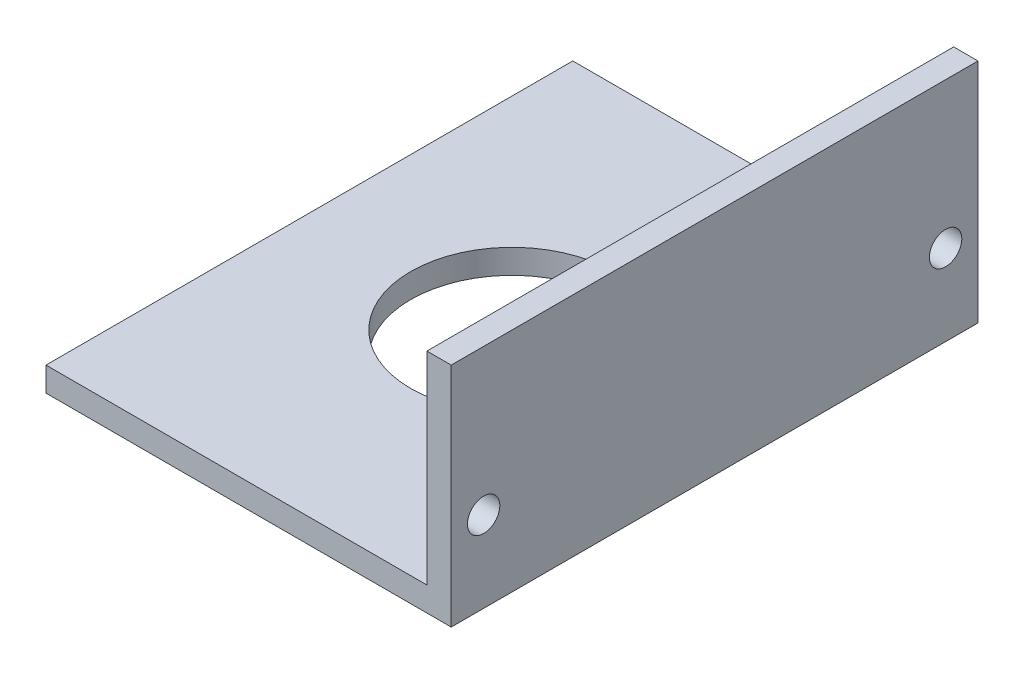
ISO-10303-21;
HEADER;
FILE_DESCRIPTION(('STEP AP214'),'2;1');
FILE_NAME('part.step','',(''),(''),'','','');
FILE_SCHEMA(('AUTOMOTIVE_DESIGN { 1 0 10303 214 1 1 1 1 }'));
ENDSEC;
DATA;
#1=APPLICATION_CONTEXT('core data for automotive mechanical design processes');
#2=APPLICATION_PROTOCOL_DEFINITION('international standard','automotive_design',2000,#1);
#3=PRODUCT_CONTEXT('',#1,'mechanical');
#4=PRODUCT('Part','Part','',(#3));
#5=PRODUCT_RELATED_PRODUCT_CATEGORY('part','',(#4));
#6=PRODUCT_DEFINITION_FORMATION('','',#4);
#7=PRODUCT_DEFINITION_CONTEXT('part definition',#1,'design');
#8=PRODUCT_DEFINITION('design','',#6,#7);
#9=PRODUCT_DEFINITION_SHAPE('','',#8);
#10=(LENGTH_UNIT() NAMED_UNIT(*) SI_UNIT(.MILLI.,.METRE.));
#11=(NAMED_UNIT(*) PLANE_ANGLE_UNIT() SI_UNIT($,.RADIAN.));
#12=(NAMED_UNIT(*) SI_UNIT($,.STERADIAN.) SOLID_ANGLE_UNIT());
#13=UNCERTAINTY_MEASURE_WITH_UNIT(LENGTH_MEASURE(1.E-05),#10,'distance_accuracy_value','');
#14=(GEOMETRIC_REPRESENTATION_CONTEXT(3) GLOBAL_UNCERTAINTY_ASSIGNED_CONTEXT((#13)) GLOBAL_UNIT_ASSIGNED_CONTEXT((#10,
#11,#12)) REPRESENTATION_CONTEXT('',''));
#15=CARTESIAN_POINT('',(0.,0.,0.));
#16=DIRECTION('',(0.,0.,1.));
#17=DIRECTION('',(1.,0.,0.));
#18=AXIS2_PLACEMENT_3D('',#15,#16,#17);
#19=CARTESIAN_POINT('',(25.,3.,-32.4999999999999));
#20=DIRECTION('',(-1.,0.,0.));
#21=DIRECTION('',(0.,0.,1.));
#22=AXIS2_PLACEMENT_3D('',#19,#20,#21);
#23=PLANE('',#22);
#24=CARTESIAN_POINT('',(25.,10.,-28.4999999999999));
#25=DIRECTION('',(-1.,0.,0.));
#26=DIRECTION('',(0.,0.,1.));
#27=AXIS2_PLACEMENT_3D('',#24,#25,#26);
#28=CIRCLE('',#27,2.);
#29=CARTESIAN_POINT('',(25.,10.,-26.4999999999999));
#30=VERTEX_POINT('',#29);
#31=EDGE_CURVE('E181',#30,#30,#28,.T.);
#32=ORIENTED_EDGE('',*,*,#31,.T.);
#33=EDGE_LOOP('',(#32));
#34=FACE_BOUND('',#33,.T.);
#35=CARTESIAN_POINT('',(25.,10.,28.5000000000001));
#36=DIRECTION('',(-1.,0.,0.));
#37=DIRECTION('',(0.,0.,1.));
#38=AXIS2_PLACEMENT_3D('',#35,#36,#37);
#39=CIRCLE('',#38,2.);
#40=CARTESIAN_POINT('',(25.,10.,30.5000000000001));
#41=VERTEX_POINT('',#40);
#42=EDGE_CURVE('E184',#41,#41,#39,.T.);
#43=ORIENTED_EDGE('',*,*,#42,.T.);
#44=EDGE_LOOP('',(#43));
#45=FACE_BOUND('',#44,.T.);
#46=DIRECTION('',(0.,0.,-1.));
#47=VECTOR('',#46,1.);
#48=CARTESIAN_POINT('',(25.,0.,-32.4999999999999));
#49=LINE('',#48,#47);
#50=CARTESIAN_POINT('',(25.,0.,32.5000000000001));
#51=VERTEX_POINT('',#50);
#52=CARTESIAN_POINT('',(25.,0.,-32.4999999999999));
#53=VERTEX_POINT('',#52);
#54=EDGE_CURVE('E102',#51,#53,#49,.T.);
#55=ORIENTED_EDGE('',*,*,#54,.T.);
#56=DIRECTION('',(0.,-1.,0.));
#57=VECTOR('',#56,1.);
#58=CARTESIAN_POINT('',(25.,3.,-32.4999999999999));
#59=LINE('',#58,#57);
#60=CARTESIAN_POINT('',(25.,28.,-32.4999999999999));
#61=VERTEX_POINT('',#60);
#62=EDGE_CURVE('E13',#61,#53,#59,.T.);
#63=ORIENTED_EDGE('',*,*,#62,.F.);
#64=DIRECTION('',(0.,0.,-1.));
#65=VECTOR('',#64,1.);
#66=CARTESIAN_POINT('',(25.,28.,32.5000000000001));
#67=LINE('',#66,#65);
#68=CARTESIAN_POINT('',(25.,28.,32.5000000000001));
#69=VERTEX_POINT('',#68);
#70=EDGE_CURVE('E104',#69,#61,#67,.T.);
#71=ORIENTED_EDGE('',*,*,#70,.F.);
#72=DIRECTION('',(0.,-1.,0.));
#73=VECTOR('',#72,1.);
#74=CARTESIAN_POINT('',(25.,3.,32.5000000000001));
#75=LINE('',#74,#73);
#76=EDGE_CURVE('E89',#69,#51,#75,.T.);
#77=ORIENTED_EDGE('',*,*,#76,.T.);
#78=EDGE_LOOP('',(#55,#63,#71,#77));
#79=FACE_BOUND('',#78,.T.);
#80=ADVANCED_FACE('F44',(#34,#45,#79),#23,.F.);
#81=CARTESIAN_POINT('',(-25.,3.,-32.4999999999999));
#82=DIRECTION('',(0.,0.,1.));
#83=DIRECTION('',(1.,0.,0.));
#84=AXIS2_PLACEMENT_3D('',#81,#82,#83);
#85=PLANE('',#84);
#86=DIRECTION('',(-1.,0.,0.));
#87=VECTOR('',#86,1.);
#88=CARTESIAN_POINT('',(-25.,0.,-32.4999999999999));
#89=LINE('',#88,#87);
#90=CARTESIAN_POINT('',(-25.,0.,-32.4999999999999));
#91=VERTEX_POINT('',#90);
#92=EDGE_CURVE('E109',#53,#91,#89,.T.);
#93=ORIENTED_EDGE('',*,*,#92,.T.);
#94=DIRECTION('',(0.,-1.,0.));
#95=VECTOR('',#94,1.);
#96=CARTESIAN_POINT('',(-25.,3.,-32.4999999999999));
#97=LINE('',#96,#95);
#98=CARTESIAN_POINT('',(-25.,3.,-32.4999999999999));
#99=VERTEX_POINT('',#98);
#100=EDGE_CURVE('E51',#99,#91,#97,.T.);
#101=ORIENTED_EDGE('',*,*,#100,.F.);
#102=DIRECTION('',(-1.,0.,0.));
#103=VECTOR('',#102,1.);
#104=CARTESIAN_POINT('',(-25.,3.,-32.4999999999999));
#105=LINE('',#104,#103);
#106=CARTESIAN_POINT('',(22.,3.,-32.4999999999999));
#107=VERTEX_POINT('',#106);
#108=EDGE_CURVE('E96',#107,#99,#105,.T.);
#109=ORIENTED_EDGE('',*,*,#108,.F.);
#110=DIRECTION('',(0.,-1.,0.));
#111=VECTOR('',#110,1.);
#112=CARTESIAN_POINT('',(22.,28.,-32.4999999999999));
#113=LINE('',#112,#111);
#114=CARTESIAN_POINT('',(22.,28.,-32.4999999999999));
#115=VERTEX_POINT('',#114);
#116=EDGE_CURVE('E110',#115,#107,#113,.T.);
#117=ORIENTED_EDGE('',*,*,#116,.F.);
#118=DIRECTION('',(-1.,0.,0.));
#119=VECTOR('',#118,1.);
#120=CARTESIAN_POINT('',(25.,28.,-32.4999999999999));
#121=LINE('',#120,#119);
#122=EDGE_CURVE('E130',#61,#115,#121,.T.);
#123=ORIENTED_EDGE('',*,*,#122,.F.);
#124=ORIENTED_EDGE('',*,*,#62,.T.);
#125=EDGE_LOOP('',(#93,#101,#109,#117,#123,#124));
#126=FACE_BOUND('',#125,.T.);
#127=ADVANCED_FACE('F125',(#126),#85,.F.);
#128=CARTESIAN_POINT('',(-25.,3.,-32.4999999999999));
#129=DIRECTION('',(1.,0.,0.));
#130=DIRECTION('',(0.,0.,-1.));
#131=AXIS2_PLACEMENT_3D('',#128,#129,#130);
#132=PLANE('',#131);
#133=DIRECTION('',(0.,0.,1.));
#134=VECTOR('',#133,1.);
#135=CARTESIAN_POINT('',(-25.,0.,-32.4999999999999));
#136=LINE('',#135,#134);
#137=CARTESIAN_POINT('',(-25.,0.,32.5000000000001));
#138=VERTEX_POINT('',#137);
#139=EDGE_CURVE('E97',#91,#138,#136,.T.);
#140=ORIENTED_EDGE('',*,*,#139,.T.);
#141=DIRECTION('',(0.,-1.,0.));
#142=VECTOR('',#141,1.);
#143=CARTESIAN_POINT('',(-25.,3.,32.5000000000001));
#144=LINE('',#143,#142);
#145=CARTESIAN_POINT('',(-25.,3.,32.5000000000001));
#146=VERTEX_POINT('',#145);
#147=EDGE_CURVE('E92',#146,#138,#144,.T.);
#148=ORIENTED_EDGE('',*,*,#147,.F.);
#149=DIRECTION('',(0.,0.,1.));
#150=VECTOR('',#149,1.);
#151=CARTESIAN_POINT('',(-25.,3.,-32.4999999999999));
#152=LINE('',#151,#150);
#153=EDGE_CURVE('E64',#99,#146,#152,.T.);
#154=ORIENTED_EDGE('',*,*,#153,.F.);
#155=ORIENTED_EDGE('',*,*,#100,.T.);
#156=EDGE_LOOP('',(#140,#148,#154,#155));
#157=FACE_BOUND('',#156,.T.);
#158=ADVANCED_FACE('F123',(#157),#132,.F.);
#159=CARTESIAN_POINT('',(-25.,3.,32.5000000000001));
#160=DIRECTION('',(0.,0.,-1.));
#161=DIRECTION('',(-1.,0.,0.));
#162=AXIS2_PLACEMENT_3D('',#159,#160,#161);
#163=PLANE('',#162);
#164=DIRECTION('',(1.,0.,0.));
#165=VECTOR('',#164,1.);
#166=CARTESIAN_POINT('',(-25.,0.,32.5000000000001));
#167=LINE('',#166,#165);
#168=EDGE_CURVE('E84',#138,#51,#167,.T.);
#169=ORIENTED_EDGE('',*,*,#168,.T.);
#170=ORIENTED_EDGE('',*,*,#76,.F.);
#171=DIRECTION('',(1.,0.,0.));
#172=VECTOR('',#171,1.);
#173=CARTESIAN_POINT('',(22.,28.,32.5000000000001));
#174=LINE('',#173,#172);
#175=CARTESIAN_POINT('',(22.,28.,32.5000000000001));
#176=VERTEX_POINT('',#175);
#177=EDGE_CURVE('E136',#176,#69,#174,.T.);
#178=ORIENTED_EDGE('',*,*,#177,.F.);
#179=DIRECTION('',(0.,-1.,0.));
#180=VECTOR('',#179,1.);
#181=CARTESIAN_POINT('',(22.,28.,32.5000000000001));
#182=LINE('',#181,#180);
#183=CARTESIAN_POINT('',(22.,3.,32.5000000000001));
#184=VERTEX_POINT('',#183);
#185=EDGE_CURVE('E114',#176,#184,#182,.T.);
#186=ORIENTED_EDGE('',*,*,#185,.T.);
#187=DIRECTION('',(1.,0.,0.));
#188=VECTOR('',#187,1.);
#189=CARTESIAN_POINT('',(-25.,3.,32.5000000000001));
#190=LINE('',#189,#188);
#191=EDGE_CURVE('E106',#146,#184,#190,.T.);
#192=ORIENTED_EDGE('',*,*,#191,.F.);
#193=ORIENTED_EDGE('',*,*,#147,.T.);
#194=EDGE_LOOP('',(#169,#170,#178,#186,#192,#193));
#195=FACE_BOUND('',#194,.T.);
#196=ADVANCED_FACE('F86',(#195),#163,.F.);
#197=CARTESIAN_POINT('',(0.,3.,0.));
#198=DIRECTION('',(0.,1.,0.));
#199=DIRECTION('',(0.,0.,1.));
#200=AXIS2_PLACEMENT_3D('',#197,#198,#199);
#201=PLANE('',#200);
#202=CARTESIAN_POINT('',(0.,3.,0.));
#203=DIRECTION('',(0.,1.,0.));
#204=DIRECTION('',(0.,0.,1.));
#205=AXIS2_PLACEMENT_3D('',#202,#203,#204);
#206=CIRCLE('',#205,12.499228857819);
#207=CARTESIAN_POINT('',(0.,3.,12.499228857819));
#208=VERTEX_POINT('',#207);
#209=EDGE_CURVE('E145',#208,#208,#206,.F.);
#210=ORIENTED_EDGE('',*,*,#209,.T.);
#211=EDGE_LOOP('',(#210));
#212=FACE_BOUND('',#211,.T.);
#213=DIRECTION('',(0.,0.,1.));
#214=VECTOR('',#213,1.);
#215=CARTESIAN_POINT('',(22.,3.,32.5000000000001));
#216=LINE('',#215,#214);
#217=EDGE_CURVE('E58',#107,#184,#216,.T.);
#218=ORIENTED_EDGE('',*,*,#217,.F.);
#219=ORIENTED_EDGE('',*,*,#108,.T.);
#220=ORIENTED_EDGE('',*,*,#153,.T.);
#221=ORIENTED_EDGE('',*,*,#191,.T.);
#222=EDGE_LOOP('',(#218,#219,#220,#221));
#223=FACE_BOUND('',#222,.T.);
#224=ADVANCED_FACE('F149',(#212,#223),#201,.T.);
#225=CARTESIAN_POINT('',(0.,0.,0.));
#226=DIRECTION('',(0.,1.,0.));
#227=DIRECTION('',(0.,0.,1.));
#228=AXIS2_PLACEMENT_3D('',#225,#226,#227);
#229=PLANE('',#228);
#230=CARTESIAN_POINT('',(0.,0.,0.));
#231=DIRECTION('',(0.,-1.,0.));
#232=DIRECTION('',(0.,0.,-1.));
#233=AXIS2_PLACEMENT_3D('',#230,#231,#232);
#234=CIRCLE('',#233,12.499228857819);
#235=CARTESIAN_POINT('',(0.,0.,-12.499228857819));
#236=VERTEX_POINT('',#235);
#237=EDGE_CURVE('E186',#236,#236,#234,.T.);
#238=ORIENTED_EDGE('',*,*,#237,.F.);
#239=EDGE_LOOP('',(#238));
#240=FACE_BOUND('',#239,.T.);
#241=ORIENTED_EDGE('',*,*,#54,.F.);
#242=ORIENTED_EDGE('',*,*,#168,.F.);
#243=ORIENTED_EDGE('',*,*,#139,.F.);
#244=ORIENTED_EDGE('',*,*,#92,.F.);
#245=EDGE_LOOP('',(#241,#242,#243,#244));
#246=FACE_BOUND('',#245,.T.);
#247=ADVANCED_FACE('F108',(#240,#246),#229,.F.);
#248=CARTESIAN_POINT('',(22.,28.,32.5000000000001));
#249=DIRECTION('',(1.,0.,0.));
#250=DIRECTION('',(0.,0.,-1.));
#251=AXIS2_PLACEMENT_3D('',#248,#249,#250);
#252=PLANE('',#251);
#253=CARTESIAN_POINT('',(22.,10.,-28.4999999999999));
#254=DIRECTION('',(-1.,0.,0.));
#255=DIRECTION('',(0.,0.,1.));
#256=AXIS2_PLACEMENT_3D('',#253,#254,#255);
#257=CIRCLE('',#256,2.);
#258=CARTESIAN_POINT('',(22.,10.,-26.4999999999999));
#259=VERTEX_POINT('',#258);
#260=EDGE_CURVE('E214',#259,#259,#257,.T.);
#261=ORIENTED_EDGE('',*,*,#260,.F.);
#262=EDGE_LOOP('',(#261));
#263=FACE_BOUND('',#262,.T.);
#264=CARTESIAN_POINT('',(22.,10.,28.5000000000001));
#265=DIRECTION('',(-1.,0.,0.));
#266=DIRECTION('',(0.,0.,1.));
#267=AXIS2_PLACEMENT_3D('',#264,#265,#266);
#268=CIRCLE('',#267,2.);
#269=CARTESIAN_POINT('',(22.,10.,30.5000000000001));
#270=VERTEX_POINT('',#269);
#271=EDGE_CURVE('E187',#270,#270,#268,.T.);
#272=ORIENTED_EDGE('',*,*,#271,.F.);
#273=EDGE_LOOP('',(#272));
#274=FACE_BOUND('',#273,.T.);
#275=ORIENTED_EDGE('',*,*,#217,.T.);
#276=ORIENTED_EDGE('',*,*,#185,.F.);
#277=DIRECTION('',(0.,0.,1.));
#278=VECTOR('',#277,1.);
#279=CARTESIAN_POINT('',(22.,28.,32.5000000000001));
#280=LINE('',#279,#278);
#281=EDGE_CURVE('E138',#115,#176,#280,.T.);
#282=ORIENTED_EDGE('',*,*,#281,.F.);
#283=ORIENTED_EDGE('',*,*,#116,.T.);
#284=EDGE_LOOP('',(#275,#276,#282,#283));
#285=FACE_BOUND('',#284,.T.);
#286=ADVANCED_FACE('F152',(#263,#274,#285),#252,.F.);
#287=CARTESIAN_POINT('',(0.,28.,0.));
#288=DIRECTION('',(0.,1.,0.));
#289=DIRECTION('',(0.,0.,1.));
#290=AXIS2_PLACEMENT_3D('',#287,#288,#289);
#291=PLANE('',#290);
#292=ORIENTED_EDGE('',*,*,#177,.T.);
#293=ORIENTED_EDGE('',*,*,#70,.T.);
#294=ORIENTED_EDGE('',*,*,#122,.T.);
#295=ORIENTED_EDGE('',*,*,#281,.T.);
#296=EDGE_LOOP('',(#292,#293,#294,#295));
#297=FACE_BOUND('',#296,.T.);
#298=ADVANCED_FACE('F134',(#297),#291,.T.);
#299=CARTESIAN_POINT('',(0.,38.3531579398655,0.));
#300=DIRECTION('',(0.,-1.,0.));
#301=DIRECTION('',(0.,0.,-1.));
#302=AXIS2_PLACEMENT_3D('',#299,#300,#301);
#303=CYLINDRICAL_SURFACE('',#302,12.499228857819);
#304=ORIENTED_EDGE('',*,*,#237,.T.);
#305=EDGE_LOOP('',(#304));
#306=FACE_BOUND('',#305,.T.);
#307=ORIENTED_EDGE('',*,*,#209,.F.);
#308=EDGE_LOOP('',(#307));
#309=FACE_BOUND('',#308,.T.);
#310=ADVANCED_FACE('F165',(#306,#309),#303,.F.);
#311=CARTESIAN_POINT('',(52.,10.,28.5000000000001));
#312=DIRECTION('',(-1.,0.,0.));
#313=DIRECTION('',(0.,0.,1.));
#314=AXIS2_PLACEMENT_3D('',#311,#312,#313);
#315=CYLINDRICAL_SURFACE('',#314,2.);
#316=ORIENTED_EDGE('',*,*,#271,.T.);
#317=EDGE_LOOP('',(#316));
#318=FACE_BOUND('',#317,.T.);
#319=ORIENTED_EDGE('',*,*,#42,.F.);
#320=EDGE_LOOP('',(#319));
#321=FACE_BOUND('',#320,.T.);
#322=ADVANCED_FACE('F199',(#318,#321),#315,.F.);
#323=CARTESIAN_POINT('',(52.,10.,-28.4999999999999));
#324=DIRECTION('',(-1.,0.,0.));
#325=DIRECTION('',(0.,0.,1.));
#326=AXIS2_PLACEMENT_3D('',#323,#324,#325);
#327=CYLINDRICAL_SURFACE('',#326,2.);
#328=ORIENTED_EDGE('',*,*,#260,.T.);
#329=EDGE_LOOP('',(#328));
#330=FACE_BOUND('',#329,.T.);
#331=ORIENTED_EDGE('',*,*,#31,.F.);
#332=EDGE_LOOP('',(#331));
#333=FACE_BOUND('',#332,.T.);
#334=ADVANCED_FACE('F204',(#330,#333),#327,.F.);
#335=CLOSED_SHELL('',(#80,#127,#158,#196,#224,#247,#286,#298,#310,#322,#334));
#336=MANIFOLD_SOLID_BREP('B2',#335);
#337=ADVANCED_BREP_SHAPE_REPRESENTATION('',(#18,#336),#14);
#338=SHAPE_DEFINITION_REPRESENTATION(#9,#337);
ENDSEC;
END-ISO-10303-21;
